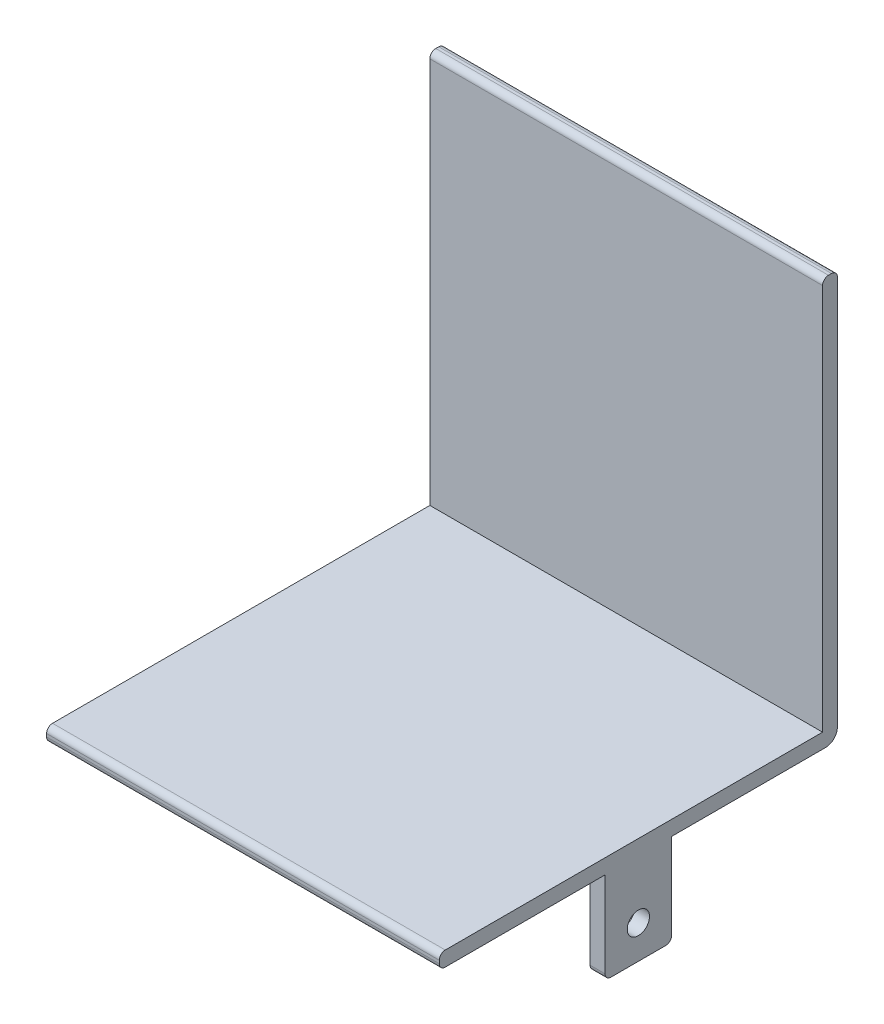
ISO-10303-21;
HEADER;
FILE_DESCRIPTION(('STEP AP214'),'2;1');
FILE_NAME('part.step','',(''),(''),'','','');
FILE_SCHEMA(('AUTOMOTIVE_DESIGN { 1 0 10303 214 1 1 1 1 }'));
ENDSEC;
DATA;
#1=APPLICATION_CONTEXT('core data for automotive mechanical design processes');
#2=APPLICATION_PROTOCOL_DEFINITION('international standard','automotive_design',2000,#1);
#3=PRODUCT_CONTEXT('',#1,'mechanical');
#4=PRODUCT('Part','Part','',(#3));
#5=PRODUCT_RELATED_PRODUCT_CATEGORY('part','',(#4));
#6=PRODUCT_DEFINITION_FORMATION('','',#4);
#7=PRODUCT_DEFINITION_CONTEXT('part definition',#1,'design');
#8=PRODUCT_DEFINITION('design','',#6,#7);
#9=PRODUCT_DEFINITION_SHAPE('','',#8);
#10=(LENGTH_UNIT() NAMED_UNIT(*) SI_UNIT(.MILLI.,.METRE.));
#11=(NAMED_UNIT(*) PLANE_ANGLE_UNIT() SI_UNIT($,.RADIAN.));
#12=(NAMED_UNIT(*) SI_UNIT($,.STERADIAN.) SOLID_ANGLE_UNIT());
#13=UNCERTAINTY_MEASURE_WITH_UNIT(LENGTH_MEASURE(1.E-05),#10,'distance_accuracy_value','');
#14=(GEOMETRIC_REPRESENTATION_CONTEXT(3) GLOBAL_UNCERTAINTY_ASSIGNED_CONTEXT((#13)) GLOBAL_UNIT_ASSIGNED_CONTEXT((#10,
#11,#12)) REPRESENTATION_CONTEXT('',''));
#15=CARTESIAN_POINT('',(0.,0.,0.));
#16=DIRECTION('',(0.,0.,1.));
#17=DIRECTION('',(1.,0.,0.));
#18=AXIS2_PLACEMENT_3D('',#15,#16,#17);
#19=CARTESIAN_POINT('',(84.074,0.,83.947));
#20=DIRECTION('',(0.,1.,0.));
#21=DIRECTION('',(0.,0.,1.));
#22=AXIS2_PLACEMENT_3D('',#19,#20,#21);
#23=PLANE('',#22);
#24=DIRECTION('',(1.,0.,0.));
#25=VECTOR('',#24,1.);
#26=CARTESIAN_POINT('',(80.899,0.,49.75225));
#27=LINE('',#26,#25);
#28=CARTESIAN_POINT('',(80.899,0.,49.75225));
#29=VERTEX_POINT('',#28);
#30=CARTESIAN_POINT('',(84.074,0.,49.75225));
#31=VERTEX_POINT('',#30);
#32=EDGE_CURVE('E283',#29,#31,#27,.T.);
#33=ORIENTED_EDGE('',*,*,#32,.T.);
#34=DIRECTION('',(0.,0.,-1.));
#35=VECTOR('',#34,1.);
#36=CARTESIAN_POINT('',(84.074,0.,83.947));
#37=LINE('',#36,#35);
#38=CARTESIAN_POINT('',(84.074,0.,83.947));
#39=VERTEX_POINT('',#38);
#40=EDGE_CURVE('E168',#39,#31,#37,.T.);
#41=ORIENTED_EDGE('',*,*,#40,.F.);
#42=DIRECTION('',(-1.,0.,0.));
#43=VECTOR('',#42,1.);
#44=CARTESIAN_POINT('',(84.074,0.,83.947));
#45=LINE('',#44,#43);
#46=CARTESIAN_POINT('',(0.,0.,83.947));
#47=VERTEX_POINT('',#46);
#48=EDGE_CURVE('E161',#39,#47,#45,.T.);
#49=ORIENTED_EDGE('',*,*,#48,.T.);
#50=DIRECTION('',(0.,0.,-1.));
#51=VECTOR('',#50,1.);
#52=CARTESIAN_POINT('',(0.,0.,83.947));
#53=LINE('',#52,#51);
#54=CARTESIAN_POINT('',(0.,0.,2.54000000000002));
#55=VERTEX_POINT('',#54);
#56=EDGE_CURVE('E104',#47,#55,#53,.T.);
#57=ORIENTED_EDGE('',*,*,#56,.T.);
#58=DIRECTION('',(-1.,0.,0.));
#59=VECTOR('',#58,1.);
#60=CARTESIAN_POINT('',(84.074,0.,2.54000000000002));
#61=LINE('',#60,#59);
#62=CARTESIAN_POINT('',(84.074,0.,2.54000000000002));
#63=VERTEX_POINT('',#62);
#64=EDGE_CURVE('E173',#63,#55,#61,.T.);
#65=ORIENTED_EDGE('',*,*,#64,.F.);
#66=CARTESIAN_POINT('',(84.074,0.,35.46475));
#67=VERTEX_POINT('',#66);
#68=EDGE_CURVE('E61',#67,#63,#37,.T.);
#69=ORIENTED_EDGE('',*,*,#68,.F.);
#70=DIRECTION('',(1.,0.,0.));
#71=VECTOR('',#70,1.);
#72=CARTESIAN_POINT('',(80.899,0.,35.46475));
#73=LINE('',#72,#71);
#74=CARTESIAN_POINT('',(80.899,0.,35.46475));
#75=VERTEX_POINT('',#74);
#76=EDGE_CURVE('E382',#75,#67,#73,.T.);
#77=ORIENTED_EDGE('',*,*,#76,.F.);
#78=DIRECTION('',(0.,0.,-1.));
#79=VECTOR('',#78,1.);
#80=CARTESIAN_POINT('',(80.899,0.,2.54));
#81=LINE('',#80,#79);
#82=EDGE_CURVE('E351',#29,#75,#81,.T.);
#83=ORIENTED_EDGE('',*,*,#82,.F.);
#84=EDGE_LOOP('',(#33,#41,#49,#57,#65,#69,#77,#83));
#85=FACE_BOUND('',#84,.T.);
#86=ADVANCED_FACE('F39',(#85),#23,.F.);
#87=CARTESIAN_POINT('',(84.074,2.54,2.54));
#88=DIRECTION('',(-1.,0.,0.));
#89=DIRECTION('',(0.,0.,1.));
#90=AXIS2_PLACEMENT_3D('',#87,#88,#89);
#91=CYLINDRICAL_SURFACE('',#90,2.54);
#92=CARTESIAN_POINT('',(0.,2.54,2.54));
#93=DIRECTION('',(1.,0.,0.));
#94=DIRECTION('',(0.,0.,-1.));
#95=AXIS2_PLACEMENT_3D('',#92,#93,#94);
#96=CIRCLE('',#95,2.54);
#97=CARTESIAN_POINT('',(0.,2.54000000000002,0.));
#98=VERTEX_POINT('',#97);
#99=EDGE_CURVE('E174',#55,#98,#96,.T.);
#100=ORIENTED_EDGE('',*,*,#99,.T.);
#101=DIRECTION('',(-1.,0.,0.));
#102=VECTOR('',#101,1.);
#103=CARTESIAN_POINT('',(84.074,2.54000000000002,0.));
#104=LINE('',#103,#102);
#105=CARTESIAN_POINT('',(84.074,2.54000000000002,0.));
#106=VERTEX_POINT('',#105);
#107=EDGE_CURVE('E11',#106,#98,#104,.T.);
#108=ORIENTED_EDGE('',*,*,#107,.F.);
#109=CARTESIAN_POINT('',(84.074,2.54,2.54));
#110=DIRECTION('',(1.,0.,0.));
#111=DIRECTION('',(0.,0.,-1.));
#112=AXIS2_PLACEMENT_3D('',#109,#110,#111);
#113=CIRCLE('',#112,2.54);
#114=EDGE_CURVE('E207',#63,#106,#113,.T.);
#115=ORIENTED_EDGE('',*,*,#114,.F.);
#116=ORIENTED_EDGE('',*,*,#64,.T.);
#117=EDGE_LOOP('',(#100,#108,#115,#116));
#118=FACE_BOUND('',#117,.T.);
#119=ADVANCED_FACE('F41',(#118),#91,.T.);
#120=CARTESIAN_POINT('',(84.074,2.54000000000002,0.));
#121=DIRECTION('',(0.,0.,1.));
#122=DIRECTION('',(0.,-1.,0.));
#123=AXIS2_PLACEMENT_3D('',#120,#121,#122);
#124=PLANE('',#123);
#125=DIRECTION('',(0.,1.,0.));
#126=VECTOR('',#125,1.);
#127=CARTESIAN_POINT('',(0.,2.54000000000002,0.));
#128=LINE('',#127,#126);
#129=CARTESIAN_POINT('',(0.,85.979,0.));
#130=VERTEX_POINT('',#129);
#131=EDGE_CURVE('E178',#98,#130,#128,.T.);
#132=ORIENTED_EDGE('',*,*,#131,.T.);
#133=DIRECTION('',(-1.,0.,0.));
#134=VECTOR('',#133,1.);
#135=CARTESIAN_POINT('',(84.074,85.979,0.));
#136=LINE('',#135,#134);
#137=CARTESIAN_POINT('',(84.074,85.979,0.));
#138=VERTEX_POINT('',#137);
#139=EDGE_CURVE('E48',#138,#130,#136,.T.);
#140=ORIENTED_EDGE('',*,*,#139,.F.);
#141=DIRECTION('',(0.,1.,0.));
#142=VECTOR('',#141,1.);
#143=CARTESIAN_POINT('',(84.074,2.54000000000002,0.));
#144=LINE('',#143,#142);
#145=EDGE_CURVE('E112',#106,#138,#144,.T.);
#146=ORIENTED_EDGE('',*,*,#145,.F.);
#147=ORIENTED_EDGE('',*,*,#107,.T.);
#148=EDGE_LOOP('',(#132,#140,#146,#147));
#149=FACE_BOUND('',#148,.T.);
#150=ADVANCED_FACE('F394',(#149),#124,.F.);
#151=CARTESIAN_POINT('',(84.074,85.979,1.27000000000002));
#152=DIRECTION('',(-1.,0.,0.));
#153=DIRECTION('',(0.,0.,1.));
#154=AXIS2_PLACEMENT_3D('',#151,#152,#153);
#155=CYLINDRICAL_SURFACE('',#154,1.27);
#156=CARTESIAN_POINT('',(0.,85.979,1.27000000000002));
#157=DIRECTION('',(1.,0.,0.));
#158=DIRECTION('',(0.,0.,-1.));
#159=AXIS2_PLACEMENT_3D('',#156,#157,#158);
#160=CIRCLE('',#159,1.27);
#161=CARTESIAN_POINT('',(0.,87.249,1.27000000000002));
#162=VERTEX_POINT('',#161);
#163=EDGE_CURVE('E182',#130,#162,#160,.T.);
#164=ORIENTED_EDGE('',*,*,#163,.T.);
#165=DIRECTION('',(-1.,0.,0.));
#166=VECTOR('',#165,1.);
#167=CARTESIAN_POINT('',(84.074,87.249,1.27000000000002));
#168=LINE('',#167,#166);
#169=CARTESIAN_POINT('',(84.074,87.249,1.27000000000002));
#170=VERTEX_POINT('',#169);
#171=EDGE_CURVE('E230',#170,#162,#168,.T.);
#172=ORIENTED_EDGE('',*,*,#171,.F.);
#173=CARTESIAN_POINT('',(84.074,85.979,1.27000000000002));
#174=DIRECTION('',(1.,0.,0.));
#175=DIRECTION('',(0.,0.,-1.));
#176=AXIS2_PLACEMENT_3D('',#173,#174,#175);
#177=CIRCLE('',#176,1.27);
#178=EDGE_CURVE('E240',#138,#170,#177,.T.);
#179=ORIENTED_EDGE('',*,*,#178,.F.);
#180=ORIENTED_EDGE('',*,*,#139,.T.);
#181=EDGE_LOOP('',(#164,#172,#179,#180));
#182=FACE_BOUND('',#181,.T.);
#183=ADVANCED_FACE('F238',(#182),#155,.T.);
#184=CARTESIAN_POINT('',(84.074,87.249,1.90500000000002));
#185=DIRECTION('',(0.,-1.,0.));
#186=DIRECTION('',(0.,0.,-1.));
#187=AXIS2_PLACEMENT_3D('',#184,#185,#186);
#188=PLANE('',#187);
#189=DIRECTION('',(0.,0.,1.));
#190=VECTOR('',#189,1.);
#191=CARTESIAN_POINT('',(0.,87.249,1.90500000000002));
#192=LINE('',#191,#190);
#193=CARTESIAN_POINT('',(0.,87.249,1.90500000000002));
#194=VERTEX_POINT('',#193);
#195=EDGE_CURVE('E185',#162,#194,#192,.T.);
#196=ORIENTED_EDGE('',*,*,#195,.T.);
#197=DIRECTION('',(-1.,0.,0.));
#198=VECTOR('',#197,1.);
#199=CARTESIAN_POINT('',(84.074,87.249,1.90500000000002));
#200=LINE('',#199,#198);
#201=CARTESIAN_POINT('',(84.074,87.249,1.90500000000002));
#202=VERTEX_POINT('',#201);
#203=EDGE_CURVE('E226',#202,#194,#200,.T.);
#204=ORIENTED_EDGE('',*,*,#203,.F.);
#205=DIRECTION('',(0.,0.,1.));
#206=VECTOR('',#205,1.);
#207=CARTESIAN_POINT('',(84.074,87.249,1.90500000000002));
#208=LINE('',#207,#206);
#209=EDGE_CURVE('E259',#170,#202,#208,.T.);
#210=ORIENTED_EDGE('',*,*,#209,.F.);
#211=ORIENTED_EDGE('',*,*,#171,.T.);
#212=EDGE_LOOP('',(#196,#204,#210,#211));
#213=FACE_BOUND('',#212,.T.);
#214=ADVANCED_FACE('F249',(#213),#188,.F.);
#215=CARTESIAN_POINT('',(84.074,85.979,1.90500000000002));
#216=DIRECTION('',(-1.,0.,0.));
#217=DIRECTION('',(0.,0.,1.));
#218=AXIS2_PLACEMENT_3D('',#215,#216,#217);
#219=CYLINDRICAL_SURFACE('',#218,1.27);
#220=CARTESIAN_POINT('',(0.,85.979,1.90500000000002));
#221=DIRECTION('',(1.,0.,0.));
#222=DIRECTION('',(0.,0.,1.));
#223=AXIS2_PLACEMENT_3D('',#220,#221,#222);
#224=CIRCLE('',#223,1.27);
#225=CARTESIAN_POINT('',(0.,85.979,3.17500000000002));
#226=VERTEX_POINT('',#225);
#227=EDGE_CURVE('E188',#194,#226,#224,.T.);
#228=ORIENTED_EDGE('',*,*,#227,.T.);
#229=DIRECTION('',(-1.,0.,0.));
#230=VECTOR('',#229,1.);
#231=CARTESIAN_POINT('',(84.074,85.979,3.17500000000002));
#232=LINE('',#231,#230);
#233=CARTESIAN_POINT('',(84.074,85.979,3.17500000000002));
#234=VERTEX_POINT('',#233);
#235=EDGE_CURVE('E222',#234,#226,#232,.T.);
#236=ORIENTED_EDGE('',*,*,#235,.F.);
#237=CARTESIAN_POINT('',(84.074,85.979,1.90500000000002));
#238=DIRECTION('',(1.,0.,0.));
#239=DIRECTION('',(0.,0.,1.));
#240=AXIS2_PLACEMENT_3D('',#237,#238,#239);
#241=CIRCLE('',#240,1.27);
#242=EDGE_CURVE('E255',#202,#234,#241,.T.);
#243=ORIENTED_EDGE('',*,*,#242,.F.);
#244=ORIENTED_EDGE('',*,*,#203,.T.);
#245=EDGE_LOOP('',(#228,#236,#243,#244));
#246=FACE_BOUND('',#245,.T.);
#247=ADVANCED_FACE('F253',(#246),#219,.T.);
#248=CARTESIAN_POINT('',(84.074,3.175,3.175));
#249=DIRECTION('',(0.,0.,-1.));
#250=DIRECTION('',(0.,1.,0.));
#251=AXIS2_PLACEMENT_3D('',#248,#249,#250);
#252=PLANE('',#251);
#253=DIRECTION('',(0.,-1.,0.));
#254=VECTOR('',#253,1.);
#255=CARTESIAN_POINT('',(0.,3.175,3.175));
#256=LINE('',#255,#254);
#257=CARTESIAN_POINT('',(0.,3.175,3.175));
#258=VERTEX_POINT('',#257);
#259=EDGE_CURVE('E191',#226,#258,#256,.T.);
#260=ORIENTED_EDGE('',*,*,#259,.T.);
#261=DIRECTION('',(-1.,0.,0.));
#262=VECTOR('',#261,1.);
#263=CARTESIAN_POINT('',(84.074,3.175,3.175));
#264=LINE('',#263,#262);
#265=CARTESIAN_POINT('',(84.074,3.175,3.175));
#266=VERTEX_POINT('',#265);
#267=EDGE_CURVE('E218',#266,#258,#264,.T.);
#268=ORIENTED_EDGE('',*,*,#267,.F.);
#269=DIRECTION('',(0.,-1.,0.));
#270=VECTOR('',#269,1.);
#271=CARTESIAN_POINT('',(84.074,3.175,3.175));
#272=LINE('',#271,#270);
#273=EDGE_CURVE('E258',#234,#266,#272,.T.);
#274=ORIENTED_EDGE('',*,*,#273,.F.);
#275=ORIENTED_EDGE('',*,*,#235,.T.);
#276=EDGE_LOOP('',(#260,#268,#274,#275));
#277=FACE_BOUND('',#276,.T.);
#278=ADVANCED_FACE('F416',(#277),#252,.F.);
#279=CARTESIAN_POINT('',(84.074,3.175,83.947));
#280=DIRECTION('',(0.,-1.,0.));
#281=DIRECTION('',(0.,0.,-1.));
#282=AXIS2_PLACEMENT_3D('',#279,#280,#281);
#283=PLANE('',#282);
#284=DIRECTION('',(0.,0.,1.));
#285=VECTOR('',#284,1.);
#286=CARTESIAN_POINT('',(0.,3.175,83.947));
#287=LINE('',#286,#285);
#288=CARTESIAN_POINT('',(0.,3.175,83.947));
#289=VERTEX_POINT('',#288);
#290=EDGE_CURVE('E194',#258,#289,#287,.T.);
#291=ORIENTED_EDGE('',*,*,#290,.T.);
#292=DIRECTION('',(-1.,0.,0.));
#293=VECTOR('',#292,1.);
#294=CARTESIAN_POINT('',(84.074,3.175,83.947));
#295=LINE('',#294,#293);
#296=CARTESIAN_POINT('',(84.074,3.175,83.947));
#297=VERTEX_POINT('',#296);
#298=EDGE_CURVE('E214',#297,#289,#295,.T.);
#299=ORIENTED_EDGE('',*,*,#298,.F.);
#300=DIRECTION('',(0.,0.,1.));
#301=VECTOR('',#300,1.);
#302=CARTESIAN_POINT('',(84.074,3.175,83.947));
#303=LINE('',#302,#301);
#304=EDGE_CURVE('E263',#266,#297,#303,.T.);
#305=ORIENTED_EDGE('',*,*,#304,.F.);
#306=ORIENTED_EDGE('',*,*,#267,.T.);
#307=EDGE_LOOP('',(#291,#299,#305,#306));
#308=FACE_BOUND('',#307,.T.);
#309=ADVANCED_FACE('F274',(#308),#283,.F.);
#310=CARTESIAN_POINT('',(84.074,1.905,83.947));
#311=DIRECTION('',(-1.,0.,0.));
#312=DIRECTION('',(0.,0.,1.));
#313=AXIS2_PLACEMENT_3D('',#310,#311,#312);
#314=CYLINDRICAL_SURFACE('',#313,1.27);
#315=CARTESIAN_POINT('',(0.,1.905,83.947));
#316=DIRECTION('',(1.,0.,0.));
#317=DIRECTION('',(0.,0.,-1.));
#318=AXIS2_PLACEMENT_3D('',#315,#316,#317);
#319=CIRCLE('',#318,1.27);
#320=CARTESIAN_POINT('',(0.,1.905,85.217));
#321=VERTEX_POINT('',#320);
#322=EDGE_CURVE('E197',#289,#321,#319,.T.);
#323=ORIENTED_EDGE('',*,*,#322,.T.);
#324=DIRECTION('',(-1.,0.,0.));
#325=VECTOR('',#324,1.);
#326=CARTESIAN_POINT('',(84.074,1.905,85.217));
#327=LINE('',#326,#325);
#328=CARTESIAN_POINT('',(84.074,1.905,85.217));
#329=VERTEX_POINT('',#328);
#330=EDGE_CURVE('E160',#329,#321,#327,.T.);
#331=ORIENTED_EDGE('',*,*,#330,.F.);
#332=CARTESIAN_POINT('',(84.074,1.905,83.947));
#333=DIRECTION('',(1.,0.,0.));
#334=DIRECTION('',(0.,0.,-1.));
#335=AXIS2_PLACEMENT_3D('',#332,#333,#334);
#336=CIRCLE('',#335,1.27);
#337=EDGE_CURVE('E146',#297,#329,#336,.T.);
#338=ORIENTED_EDGE('',*,*,#337,.F.);
#339=ORIENTED_EDGE('',*,*,#298,.T.);
#340=EDGE_LOOP('',(#323,#331,#338,#339));
#341=FACE_BOUND('',#340,.T.);
#342=ADVANCED_FACE('F278',(#341),#314,.T.);
#343=CARTESIAN_POINT('',(84.074,1.905,85.217));
#344=DIRECTION('',(0.,0.,-1.));
#345=DIRECTION('',(-1.,0.,0.));
#346=AXIS2_PLACEMENT_3D('',#343,#344,#345);
#347=PLANE('',#346);
#348=DIRECTION('',(0.,-1.,0.));
#349=VECTOR('',#348,1.);
#350=CARTESIAN_POINT('',(0.,1.905,85.217));
#351=LINE('',#350,#349);
#352=CARTESIAN_POINT('',(0.,1.27,85.217));
#353=VERTEX_POINT('',#352);
#354=EDGE_CURVE('E156',#321,#353,#351,.T.);
#355=ORIENTED_EDGE('',*,*,#354,.T.);
#356=DIRECTION('',(-1.,0.,0.));
#357=VECTOR('',#356,1.);
#358=CARTESIAN_POINT('',(84.074,1.27,85.217));
#359=LINE('',#358,#357);
#360=CARTESIAN_POINT('',(84.074,1.27,85.217));
#361=VERTEX_POINT('',#360);
#362=EDGE_CURVE('E153',#361,#353,#359,.T.);
#363=ORIENTED_EDGE('',*,*,#362,.F.);
#364=DIRECTION('',(0.,-1.,0.));
#365=VECTOR('',#364,1.);
#366=CARTESIAN_POINT('',(84.074,1.905,85.217));
#367=LINE('',#366,#365);
#368=EDGE_CURVE('E137',#329,#361,#367,.T.);
#369=ORIENTED_EDGE('',*,*,#368,.F.);
#370=ORIENTED_EDGE('',*,*,#330,.T.);
#371=EDGE_LOOP('',(#355,#363,#369,#370));
#372=FACE_BOUND('',#371,.T.);
#373=ADVANCED_FACE('F154',(#372),#347,.F.);
#374=CARTESIAN_POINT('',(84.074,1.27,83.947));
#375=DIRECTION('',(-1.,0.,0.));
#376=DIRECTION('',(0.,0.,1.));
#377=AXIS2_PLACEMENT_3D('',#374,#375,#376);
#378=CYLINDRICAL_SURFACE('',#377,1.27);
#379=CARTESIAN_POINT('',(0.,1.27,83.947));
#380=DIRECTION('',(1.,0.,0.));
#381=DIRECTION('',(0.,0.,-1.));
#382=AXIS2_PLACEMENT_3D('',#379,#380,#381);
#383=CIRCLE('',#382,1.27);
#384=EDGE_CURVE('E202',#353,#47,#383,.T.);
#385=ORIENTED_EDGE('',*,*,#384,.T.);
#386=ORIENTED_EDGE('',*,*,#48,.F.);
#387=CARTESIAN_POINT('',(84.074,1.27,83.947));
#388=DIRECTION('',(1.,0.,0.));
#389=DIRECTION('',(0.,0.,-1.));
#390=AXIS2_PLACEMENT_3D('',#387,#388,#389);
#391=CIRCLE('',#390,1.27);
#392=EDGE_CURVE('E143',#361,#39,#391,.T.);
#393=ORIENTED_EDGE('',*,*,#392,.F.);
#394=ORIENTED_EDGE('',*,*,#362,.T.);
#395=EDGE_LOOP('',(#385,#386,#393,#394));
#396=FACE_BOUND('',#395,.T.);
#397=ADVANCED_FACE('F163',(#396),#378,.T.);
#398=CARTESIAN_POINT('',(84.074,2.54,2.54));
#399=DIRECTION('',(1.,0.,0.));
#400=DIRECTION('',(0.,0.,-1.));
#401=AXIS2_PLACEMENT_3D('',#398,#399,#400);
#402=PLANE('',#401);
#403=ORIENTED_EDGE('',*,*,#114,.T.);
#404=ORIENTED_EDGE('',*,*,#145,.T.);
#405=ORIENTED_EDGE('',*,*,#178,.T.);
#406=ORIENTED_EDGE('',*,*,#209,.T.);
#407=ORIENTED_EDGE('',*,*,#242,.T.);
#408=ORIENTED_EDGE('',*,*,#273,.T.);
#409=ORIENTED_EDGE('',*,*,#304,.T.);
#410=ORIENTED_EDGE('',*,*,#337,.T.);
#411=ORIENTED_EDGE('',*,*,#368,.T.);
#412=ORIENTED_EDGE('',*,*,#392,.T.);
#413=ORIENTED_EDGE('',*,*,#40,.T.);
#414=DIRECTION('',(0.,1.,0.));
#415=VECTOR('',#414,1.);
#416=CARTESIAN_POINT('',(84.074,2.53999999999996,49.75225));
#417=LINE('',#416,#415);
#418=CARTESIAN_POINT('',(84.074,-18.328132,49.75225));
#419=VERTEX_POINT('',#418);
#420=EDGE_CURVE('E288',#419,#31,#417,.T.);
#421=ORIENTED_EDGE('',*,*,#420,.F.);
#422=CARTESIAN_POINT('',(84.074,-18.328132,48.48225));
#423=DIRECTION('',(1.,0.,0.));
#424=DIRECTION('',(0.,0.,-1.));
#425=AXIS2_PLACEMENT_3D('',#422,#423,#424);
#426=CIRCLE('',#425,1.27);
#427=CARTESIAN_POINT('',(84.074,-19.598132,48.48225));
#428=VERTEX_POINT('',#427);
#429=EDGE_CURVE('E353',#419,#428,#426,.T.);
#430=ORIENTED_EDGE('',*,*,#429,.T.);
#431=DIRECTION('',(0.,0.,1.));
#432=VECTOR('',#431,1.);
#433=CARTESIAN_POINT('',(84.074,-19.598132,2.53999999999999));
#434=LINE('',#433,#432);
#435=CARTESIAN_POINT('',(84.074,-19.598132,36.73475));
#436=VERTEX_POINT('',#435);
#437=EDGE_CURVE('E347',#436,#428,#434,.T.);
#438=ORIENTED_EDGE('',*,*,#437,.F.);
#439=CARTESIAN_POINT('',(84.074,-18.328132,36.73475));
#440=DIRECTION('',(1.,0.,0.));
#441=DIRECTION('',(0.,0.,-1.));
#442=AXIS2_PLACEMENT_3D('',#439,#440,#441);
#443=CIRCLE('',#442,1.27);
#444=CARTESIAN_POINT('',(84.074,-18.328132,35.46475));
#445=VERTEX_POINT('',#444);
#446=EDGE_CURVE('E335',#436,#445,#443,.T.);
#447=ORIENTED_EDGE('',*,*,#446,.T.);
#448=DIRECTION('',(0.,-1.,0.));
#449=VECTOR('',#448,1.);
#450=CARTESIAN_POINT('',(84.074,2.54,35.46475));
#451=LINE('',#450,#449);
#452=EDGE_CURVE('E55',#67,#445,#451,.T.);
#453=ORIENTED_EDGE('',*,*,#452,.F.);
#454=ORIENTED_EDGE('',*,*,#68,.T.);
#455=EDGE_LOOP('',(#403,#404,#405,#406,#407,#408,#409,#410,#411,#412,#413,#421,#430,#438,#447,
#453,#454));
#456=FACE_BOUND('',#455,.T.);
#457=CARTESIAN_POINT('',(84.074,-12.454382,42.6085));
#458=DIRECTION('',(1.,0.,0.));
#459=DIRECTION('',(0.,0.,-1.));
#460=AXIS2_PLACEMENT_3D('',#457,#458,#459);
#461=CIRCLE('',#460,2.38125);
#462=CARTESIAN_POINT('',(84.074,-12.454382,40.22725));
#463=VERTEX_POINT('',#462);
#464=EDGE_CURVE('E356',#463,#463,#461,.T.);
#465=ORIENTED_EDGE('',*,*,#464,.F.);
#466=EDGE_LOOP('',(#465));
#467=FACE_BOUND('',#466,.T.);
#468=ADVANCED_FACE('F139',(#456,#467),#402,.T.);
#469=CARTESIAN_POINT('',(0.,2.54,2.54));
#470=DIRECTION('',(1.,0.,0.));
#471=DIRECTION('',(0.,0.,-1.));
#472=AXIS2_PLACEMENT_3D('',#469,#470,#471);
#473=PLANE('',#472);
#474=ORIENTED_EDGE('',*,*,#99,.F.);
#475=ORIENTED_EDGE('',*,*,#56,.F.);
#476=ORIENTED_EDGE('',*,*,#384,.F.);
#477=ORIENTED_EDGE('',*,*,#354,.F.);
#478=ORIENTED_EDGE('',*,*,#322,.F.);
#479=ORIENTED_EDGE('',*,*,#290,.F.);
#480=ORIENTED_EDGE('',*,*,#259,.F.);
#481=ORIENTED_EDGE('',*,*,#227,.F.);
#482=ORIENTED_EDGE('',*,*,#195,.F.);
#483=ORIENTED_EDGE('',*,*,#163,.F.);
#484=ORIENTED_EDGE('',*,*,#131,.F.);
#485=EDGE_LOOP('',(#474,#475,#476,#477,#478,#479,#480,#481,#482,#483,#484));
#486=FACE_BOUND('',#485,.T.);
#487=ADVANCED_FACE('F244',(#486),#473,.F.);
#488=CARTESIAN_POINT('',(80.899,-18.328132,36.73475));
#489=DIRECTION('',(1.,0.,0.));
#490=DIRECTION('',(0.,0.,-1.));
#491=AXIS2_PLACEMENT_3D('',#488,#489,#490);
#492=CYLINDRICAL_SURFACE('',#491,1.27);
#493=ORIENTED_EDGE('',*,*,#446,.F.);
#494=DIRECTION('',(1.,0.,0.));
#495=VECTOR('',#494,1.);
#496=CARTESIAN_POINT('',(80.899,-19.598132,36.73475));
#497=LINE('',#496,#495);
#498=CARTESIAN_POINT('',(80.899,-19.598132,36.73475));
#499=VERTEX_POINT('',#498);
#500=EDGE_CURVE('E179',#499,#436,#497,.T.);
#501=ORIENTED_EDGE('',*,*,#500,.F.);
#502=CARTESIAN_POINT('',(80.899,-18.328132,36.73475));
#503=DIRECTION('',(1.,0.,0.));
#504=DIRECTION('',(0.,0.,-1.));
#505=AXIS2_PLACEMENT_3D('',#502,#503,#504);
#506=CIRCLE('',#505,1.27);
#507=CARTESIAN_POINT('',(80.899,-18.328132,35.46475));
#508=VERTEX_POINT('',#507);
#509=EDGE_CURVE('E334',#499,#508,#506,.T.);
#510=ORIENTED_EDGE('',*,*,#509,.T.);
#511=DIRECTION('',(1.,0.,0.));
#512=VECTOR('',#511,1.);
#513=CARTESIAN_POINT('',(80.899,-18.328132,35.46475));
#514=LINE('',#513,#512);
#515=EDGE_CURVE('E342',#508,#445,#514,.T.);
#516=ORIENTED_EDGE('',*,*,#515,.T.);
#517=EDGE_LOOP('',(#493,#501,#510,#516));
#518=FACE_BOUND('',#517,.T.);
#519=ADVANCED_FACE('F333',(#518),#492,.T.);
#520=CARTESIAN_POINT('',(80.899,-19.598132,2.53999999999999));
#521=DIRECTION('',(0.,1.,0.));
#522=DIRECTION('',(0.,0.,1.));
#523=AXIS2_PLACEMENT_3D('',#520,#521,#522);
#524=PLANE('',#523);
#525=ORIENTED_EDGE('',*,*,#437,.T.);
#526=DIRECTION('',(1.,0.,0.));
#527=VECTOR('',#526,1.);
#528=CARTESIAN_POINT('',(80.899,-19.598132,48.48225));
#529=LINE('',#528,#527);
#530=CARTESIAN_POINT('',(80.899,-19.598132,48.48225));
#531=VERTEX_POINT('',#530);
#532=EDGE_CURVE('E303',#531,#428,#529,.T.);
#533=ORIENTED_EDGE('',*,*,#532,.F.);
#534=DIRECTION('',(0.,0.,1.));
#535=VECTOR('',#534,1.);
#536=CARTESIAN_POINT('',(80.899,-19.598132,2.53999999999999));
#537=LINE('',#536,#535);
#538=EDGE_CURVE('E338',#499,#531,#537,.T.);
#539=ORIENTED_EDGE('',*,*,#538,.F.);
#540=ORIENTED_EDGE('',*,*,#500,.T.);
#541=EDGE_LOOP('',(#525,#533,#539,#540));
#542=FACE_BOUND('',#541,.T.);
#543=ADVANCED_FACE('F339',(#542),#524,.F.);
#544=CARTESIAN_POINT('',(80.899,-18.328132,48.48225));
#545=DIRECTION('',(1.,0.,0.));
#546=DIRECTION('',(0.,0.,-1.));
#547=AXIS2_PLACEMENT_3D('',#544,#545,#546);
#548=CYLINDRICAL_SURFACE('',#547,1.27);
#549=ORIENTED_EDGE('',*,*,#429,.F.);
#550=DIRECTION('',(1.,0.,0.));
#551=VECTOR('',#550,1.);
#552=CARTESIAN_POINT('',(80.899,-18.328132,49.75225));
#553=LINE('',#552,#551);
#554=CARTESIAN_POINT('',(80.899,-18.328132,49.75225));
#555=VERTEX_POINT('',#554);
#556=EDGE_CURVE('E377',#555,#419,#553,.T.);
#557=ORIENTED_EDGE('',*,*,#556,.F.);
#558=CARTESIAN_POINT('',(80.899,-18.328132,48.48225));
#559=DIRECTION('',(1.,0.,0.));
#560=DIRECTION('',(0.,0.,-1.));
#561=AXIS2_PLACEMENT_3D('',#558,#559,#560);
#562=CIRCLE('',#561,1.27);
#563=EDGE_CURVE('E343',#555,#531,#562,.T.);
#564=ORIENTED_EDGE('',*,*,#563,.T.);
#565=ORIENTED_EDGE('',*,*,#532,.T.);
#566=EDGE_LOOP('',(#549,#557,#564,#565));
#567=FACE_BOUND('',#566,.T.);
#568=ADVANCED_FACE('F473',(#567),#548,.T.);
#569=CARTESIAN_POINT('',(80.899,2.53999999999996,49.75225));
#570=DIRECTION('',(0.,0.,-1.));
#571=DIRECTION('',(0.,1.,0.));
#572=AXIS2_PLACEMENT_3D('',#569,#570,#571);
#573=PLANE('',#572);
#574=ORIENTED_EDGE('',*,*,#420,.T.);
#575=ORIENTED_EDGE('',*,*,#32,.F.);
#576=DIRECTION('',(0.,1.,0.));
#577=VECTOR('',#576,1.);
#578=CARTESIAN_POINT('',(80.899,2.53999999999996,49.75225));
#579=LINE('',#578,#577);
#580=EDGE_CURVE('E361',#555,#29,#579,.T.);
#581=ORIENTED_EDGE('',*,*,#580,.F.);
#582=ORIENTED_EDGE('',*,*,#556,.T.);
#583=EDGE_LOOP('',(#574,#575,#581,#582));
#584=FACE_BOUND('',#583,.T.);
#585=ADVANCED_FACE('F480',(#584),#573,.F.);
#586=CARTESIAN_POINT('',(80.899,2.54,35.46475));
#587=DIRECTION('',(0.,0.,1.));
#588=DIRECTION('',(1.,0.,0.));
#589=AXIS2_PLACEMENT_3D('',#586,#587,#588);
#590=PLANE('',#589);
#591=ORIENTED_EDGE('',*,*,#452,.T.);
#592=ORIENTED_EDGE('',*,*,#515,.F.);
#593=DIRECTION('',(0.,-1.,0.));
#594=VECTOR('',#593,1.);
#595=CARTESIAN_POINT('',(80.899,2.54,35.46475));
#596=LINE('',#595,#594);
#597=EDGE_CURVE('E318',#75,#508,#596,.T.);
#598=ORIENTED_EDGE('',*,*,#597,.F.);
#599=ORIENTED_EDGE('',*,*,#76,.T.);
#600=EDGE_LOOP('',(#591,#592,#598,#599));
#601=FACE_BOUND('',#600,.T.);
#602=ADVANCED_FACE('F487',(#601),#590,.F.);
#603=CARTESIAN_POINT('',(80.899,-18.328132,36.73475));
#604=DIRECTION('',(1.,0.,0.));
#605=DIRECTION('',(0.,0.,-1.));
#606=AXIS2_PLACEMENT_3D('',#603,#604,#605);
#607=PLANE('',#606);
#608=CARTESIAN_POINT('',(80.899,-12.454382,42.6085));
#609=DIRECTION('',(1.,0.,0.));
#610=DIRECTION('',(0.,0.,-1.));
#611=AXIS2_PLACEMENT_3D('',#608,#609,#610);
#612=CIRCLE('',#611,2.38125);
#613=CARTESIAN_POINT('',(80.899,-12.454382,40.22725));
#614=VERTEX_POINT('',#613);
#615=EDGE_CURVE('E368',#614,#614,#612,.T.);
#616=ORIENTED_EDGE('',*,*,#615,.T.);
#617=EDGE_LOOP('',(#616));
#618=FACE_BOUND('',#617,.T.);
#619=ORIENTED_EDGE('',*,*,#509,.F.);
#620=ORIENTED_EDGE('',*,*,#538,.T.);
#621=ORIENTED_EDGE('',*,*,#563,.F.);
#622=ORIENTED_EDGE('',*,*,#580,.T.);
#623=ORIENTED_EDGE('',*,*,#82,.T.);
#624=ORIENTED_EDGE('',*,*,#597,.T.);
#625=EDGE_LOOP('',(#619,#620,#621,#622,#623,#624));
#626=FACE_BOUND('',#625,.T.);
#627=ADVANCED_FACE('F345',(#618,#626),#607,.F.);
#628=CARTESIAN_POINT('',(80.899,-12.454382,42.6085));
#629=DIRECTION('',(1.,0.,0.));
#630=DIRECTION('',(0.,0.,-1.));
#631=AXIS2_PLACEMENT_3D('',#628,#629,#630);
#632=CYLINDRICAL_SURFACE('',#631,2.38125);
#633=ORIENTED_EDGE('',*,*,#615,.F.);
#634=EDGE_LOOP('',(#633));
#635=FACE_BOUND('',#634,.T.);
#636=ORIENTED_EDGE('',*,*,#464,.T.);
#637=EDGE_LOOP('',(#636));
#638=FACE_BOUND('',#637,.T.);
#639=ADVANCED_FACE('F501',(#635,#638),#632,.F.);
#640=CLOSED_SHELL('',(#86,#119,#150,#183,#214,#247,#278,#309,#342,#373,#397,#468,#487,#519,#543,
#568,#585,#602,#627,#639));
#641=MANIFOLD_SOLID_BREP('B2',#640);
#642=ADVANCED_BREP_SHAPE_REPRESENTATION('',(#18,#641),#14);
#643=SHAPE_DEFINITION_REPRESENTATION(#9,#642);
ENDSEC;
END-ISO-10303-21;
